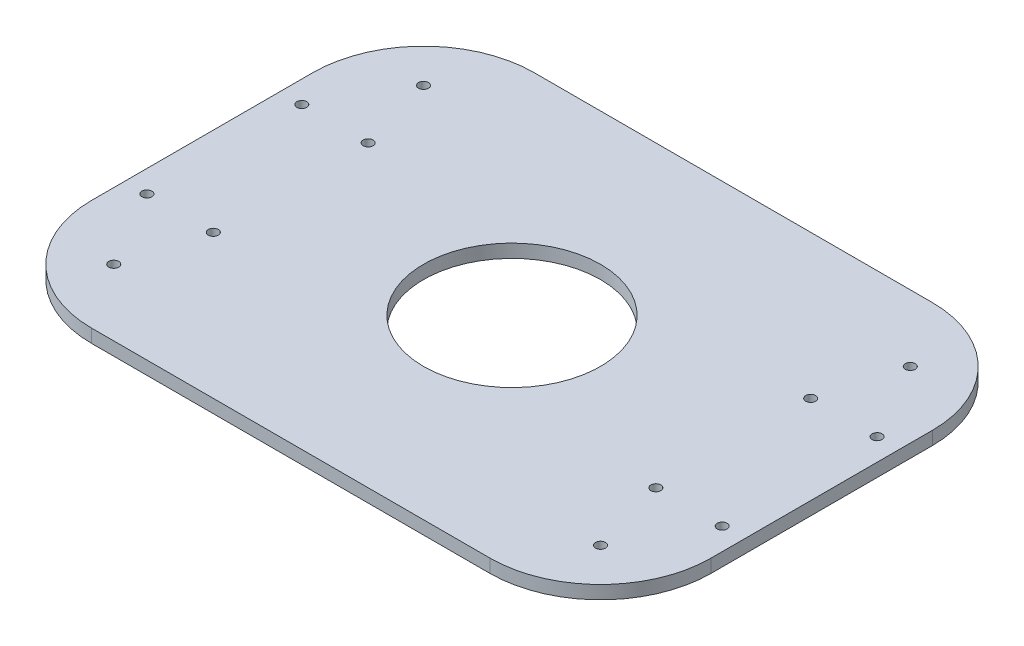
ISO-10303-21;
HEADER;
FILE_DESCRIPTION(('STEP AP214'),'2;1');
FILE_NAME('part.step','',(''),(''),'','','');
FILE_SCHEMA(('AUTOMOTIVE_DESIGN { 1 0 10303 214 1 1 1 1 }'));
ENDSEC;
DATA;
#1=APPLICATION_CONTEXT('core data for automotive mechanical design processes');
#2=APPLICATION_PROTOCOL_DEFINITION('international standard','automotive_design',2000,#1);
#3=PRODUCT_CONTEXT('',#1,'mechanical');
#4=PRODUCT('Part','Part','',(#3));
#5=PRODUCT_RELATED_PRODUCT_CATEGORY('part','',(#4));
#6=PRODUCT_DEFINITION_FORMATION('','',#4);
#7=PRODUCT_DEFINITION_CONTEXT('part definition',#1,'design');
#8=PRODUCT_DEFINITION('design','',#6,#7);
#9=PRODUCT_DEFINITION_SHAPE('','',#8);
#10=(LENGTH_UNIT() NAMED_UNIT(*) SI_UNIT(.MILLI.,.METRE.));
#11=(NAMED_UNIT(*) PLANE_ANGLE_UNIT() SI_UNIT($,.RADIAN.));
#12=(NAMED_UNIT(*) SI_UNIT($,.STERADIAN.) SOLID_ANGLE_UNIT());
#13=UNCERTAINTY_MEASURE_WITH_UNIT(LENGTH_MEASURE(1.E-05),#10,'distance_accuracy_value','');
#14=(GEOMETRIC_REPRESENTATION_CONTEXT(3) GLOBAL_UNCERTAINTY_ASSIGNED_CONTEXT((#13)) GLOBAL_UNIT_ASSIGNED_CONTEXT((#10,
#11,#12)) REPRESENTATION_CONTEXT('',''));
#15=CARTESIAN_POINT('',(0.,0.,0.));
#16=DIRECTION('',(0.,0.,1.));
#17=DIRECTION('',(1.,0.,0.));
#18=AXIS2_PLACEMENT_3D('',#15,#16,#17);
#19=CARTESIAN_POINT('',(0.,6.,0.));
#20=DIRECTION('',(0.,1.,0.));
#21=DIRECTION('',(0.,0.,1.));
#22=AXIS2_PLACEMENT_3D('',#19,#20,#21);
#23=PLANE('',#22);
#24=DIRECTION('',(0.,0.,1.));
#25=VECTOR('',#24,1.);
#26=CARTESIAN_POINT('',(140.,6.,0.));
#27=LINE('',#26,#25);
#28=CARTESIAN_POINT('',(140.,6.,-49.9999999999997));
#29=VERTEX_POINT('',#28);
#30=CARTESIAN_POINT('',(140.,6.,49.9999999999997));
#31=VERTEX_POINT('',#30);
#32=EDGE_CURVE('E371',#29,#31,#27,.T.);
#33=ORIENTED_EDGE('',*,*,#32,.F.);
#34=CARTESIAN_POINT('',(90.,6.,-50.));
#35=DIRECTION('',(0.,1.,0.));
#36=DIRECTION('',(0.,0.,1.));
#37=AXIS2_PLACEMENT_3D('',#34,#35,#36);
#38=CIRCLE('',#37,50.);
#39=CARTESIAN_POINT('',(90.,6.,-100.));
#40=VERTEX_POINT('',#39);
#41=EDGE_CURVE('E356',#29,#40,#38,.T.);
#42=ORIENTED_EDGE('',*,*,#41,.T.);
#43=DIRECTION('',(-1.,0.,0.));
#44=VECTOR('',#43,1.);
#45=CARTESIAN_POINT('',(-220.,6.,-100.));
#46=LINE('',#45,#44);
#47=CARTESIAN_POINT('',(-90.,6.,-100.));
#48=VERTEX_POINT('',#47);
#49=EDGE_CURVE('E368',#40,#48,#46,.T.);
#50=ORIENTED_EDGE('',*,*,#49,.T.);
#51=CARTESIAN_POINT('',(-90.,6.,-50.));
#52=DIRECTION('',(0.,1.,0.));
#53=DIRECTION('',(0.,0.,1.));
#54=AXIS2_PLACEMENT_3D('',#51,#52,#53);
#55=CIRCLE('',#54,50.);
#56=CARTESIAN_POINT('',(-140.,6.,-49.9999999999997));
#57=VERTEX_POINT('',#56);
#58=EDGE_CURVE('E304',#48,#57,#55,.T.);
#59=ORIENTED_EDGE('',*,*,#58,.T.);
#60=DIRECTION('',(0.,0.,1.));
#61=VECTOR('',#60,1.);
#62=CARTESIAN_POINT('',(-140.,6.,0.));
#63=LINE('',#62,#61);
#64=CARTESIAN_POINT('',(-140.,6.,49.9999999999996));
#65=VERTEX_POINT('',#64);
#66=EDGE_CURVE('E444',#57,#65,#63,.T.);
#67=ORIENTED_EDGE('',*,*,#66,.T.);
#68=CARTESIAN_POINT('',(-90.,6.,50.));
#69=DIRECTION('',(0.,1.,0.));
#70=DIRECTION('',(0.,0.,1.));
#71=AXIS2_PLACEMENT_3D('',#68,#69,#70);
#72=CIRCLE('',#71,50.);
#73=CARTESIAN_POINT('',(-90.,6.,100.));
#74=VERTEX_POINT('',#73);
#75=EDGE_CURVE('E448',#74,#65,#72,.F.);
#76=ORIENTED_EDGE('',*,*,#75,.F.);
#77=DIRECTION('',(1.,0.,0.));
#78=VECTOR('',#77,1.);
#79=CARTESIAN_POINT('',(-220.,6.,100.));
#80=LINE('',#79,#78);
#81=CARTESIAN_POINT('',(90.,6.,100.));
#82=VERTEX_POINT('',#81);
#83=EDGE_CURVE('E374',#74,#82,#80,.T.);
#84=ORIENTED_EDGE('',*,*,#83,.T.);
#85=CARTESIAN_POINT('',(90.,6.,50.));
#86=DIRECTION('',(0.,1.,0.));
#87=DIRECTION('',(0.,0.,1.));
#88=AXIS2_PLACEMENT_3D('',#85,#86,#87);
#89=CIRCLE('',#88,50.);
#90=EDGE_CURVE('E458',#82,#31,#89,.T.);
#91=ORIENTED_EDGE('',*,*,#90,.T.);
#92=EDGE_LOOP('',(#33,#42,#50,#59,#67,#76,#84,#91));
#93=FACE_BOUND('',#92,.T.);
#94=CARTESIAN_POINT('',(-130.,6.,-35.));
#95=DIRECTION('',(0.,1.,0.));
#96=DIRECTION('',(0.,0.,1.));
#97=AXIS2_PLACEMENT_3D('',#94,#95,#96);
#98=CIRCLE('',#97,2.25000000000001);
#99=CARTESIAN_POINT('',(-130.,6.,-32.75));
#100=VERTEX_POINT('',#99);
#101=EDGE_CURVE('E452',#100,#100,#98,.F.);
#102=ORIENTED_EDGE('',*,*,#101,.T.);
#103=EDGE_LOOP('',(#102));
#104=FACE_BOUND('',#103,.T.);
#105=CARTESIAN_POINT('',(-110.,6.,-70.));
#106=DIRECTION('',(0.,1.,0.));
#107=DIRECTION('',(0.,0.,1.));
#108=AXIS2_PLACEMENT_3D('',#105,#106,#107);
#109=CIRCLE('',#108,2.25);
#110=CARTESIAN_POINT('',(-110.,6.,-67.75));
#111=VERTEX_POINT('',#110);
#112=EDGE_CURVE('E466',#111,#111,#109,.F.);
#113=ORIENTED_EDGE('',*,*,#112,.T.);
#114=EDGE_LOOP('',(#113));
#115=FACE_BOUND('',#114,.T.);
#116=CARTESIAN_POINT('',(110.,6.,70.));
#117=DIRECTION('',(0.,-1.,0.));
#118=DIRECTION('',(0.,0.,-1.));
#119=AXIS2_PLACEMENT_3D('',#116,#117,#118);
#120=CIRCLE('',#119,2.25);
#121=CARTESIAN_POINT('',(110.,6.,67.75));
#122=VERTEX_POINT('',#121);
#123=EDGE_CURVE('E493',#122,#122,#120,.T.);
#124=ORIENTED_EDGE('',*,*,#123,.T.);
#125=EDGE_LOOP('',(#124));
#126=FACE_BOUND('',#125,.T.);
#127=CARTESIAN_POINT('',(-110.,6.,70.));
#128=DIRECTION('',(0.,1.,0.));
#129=DIRECTION('',(0.,0.,1.));
#130=AXIS2_PLACEMENT_3D('',#127,#128,#129);
#131=CIRCLE('',#130,2.25);
#132=CARTESIAN_POINT('',(-110.,6.,72.25));
#133=VERTEX_POINT('',#132);
#134=EDGE_CURVE('E490',#133,#133,#131,.T.);
#135=ORIENTED_EDGE('',*,*,#134,.F.);
#136=EDGE_LOOP('',(#135));
#137=FACE_BOUND('',#136,.T.);
#138=CARTESIAN_POINT('',(-100.,6.,35.));
#139=DIRECTION('',(0.,1.,0.));
#140=DIRECTION('',(0.,0.,1.));
#141=AXIS2_PLACEMENT_3D('',#138,#139,#140);
#142=CIRCLE('',#141,2.25);
#143=CARTESIAN_POINT('',(-100.,6.,37.25));
#144=VERTEX_POINT('',#143);
#145=EDGE_CURVE('E487',#144,#144,#142,.T.);
#146=ORIENTED_EDGE('',*,*,#145,.F.);
#147=EDGE_LOOP('',(#146));
#148=FACE_BOUND('',#147,.T.);
#149=CARTESIAN_POINT('',(-130.,6.,35.));
#150=DIRECTION('',(0.,1.,0.));
#151=DIRECTION('',(0.,0.,1.));
#152=AXIS2_PLACEMENT_3D('',#149,#150,#151);
#153=CIRCLE('',#152,2.25000000000001);
#154=CARTESIAN_POINT('',(-130.,6.,37.25));
#155=VERTEX_POINT('',#154);
#156=EDGE_CURVE('E484',#155,#155,#153,.T.);
#157=ORIENTED_EDGE('',*,*,#156,.F.);
#158=EDGE_LOOP('',(#157));
#159=FACE_BOUND('',#158,.T.);
#160=CARTESIAN_POINT('',(0.,6.,0.));
#161=DIRECTION('',(0.,1.,0.));
#162=DIRECTION('',(0.,0.,1.));
#163=AXIS2_PLACEMENT_3D('',#160,#161,#162);
#164=CIRCLE('',#163,40.);
#165=CARTESIAN_POINT('',(0.,6.,40.));
#166=VERTEX_POINT('',#165);
#167=EDGE_CURVE('E385',#166,#166,#164,.T.);
#168=ORIENTED_EDGE('',*,*,#167,.F.);
#169=EDGE_LOOP('',(#168));
#170=FACE_BOUND('',#169,.T.);
#171=CARTESIAN_POINT('',(100.,6.,35.));
#172=DIRECTION('',(0.,-1.,0.));
#173=DIRECTION('',(0.,0.,-1.));
#174=AXIS2_PLACEMENT_3D('',#171,#172,#173);
#175=CIRCLE('',#174,2.25);
#176=CARTESIAN_POINT('',(100.,6.,32.75));
#177=VERTEX_POINT('',#176);
#178=EDGE_CURVE('E476',#177,#177,#175,.T.);
#179=ORIENTED_EDGE('',*,*,#178,.T.);
#180=EDGE_LOOP('',(#179));
#181=FACE_BOUND('',#180,.T.);
#182=CARTESIAN_POINT('',(-100.,6.,-35.));
#183=DIRECTION('',(0.,1.,0.));
#184=DIRECTION('',(0.,0.,1.));
#185=AXIS2_PLACEMENT_3D('',#182,#183,#184);
#186=CIRCLE('',#185,2.25);
#187=CARTESIAN_POINT('',(-100.,6.,-32.75));
#188=VERTEX_POINT('',#187);
#189=EDGE_CURVE('E455',#188,#188,#186,.F.);
#190=ORIENTED_EDGE('',*,*,#189,.T.);
#191=EDGE_LOOP('',(#190));
#192=FACE_BOUND('',#191,.T.);
#193=CARTESIAN_POINT('',(110.,6.,-70.));
#194=DIRECTION('',(0.,1.,0.));
#195=DIRECTION('',(0.,0.,1.));
#196=AXIS2_PLACEMENT_3D('',#193,#194,#195);
#197=CIRCLE('',#196,2.25);
#198=CARTESIAN_POINT('',(110.,6.,-67.75));
#199=VERTEX_POINT('',#198);
#200=EDGE_CURVE('E469',#199,#199,#197,.T.);
#201=ORIENTED_EDGE('',*,*,#200,.F.);
#202=EDGE_LOOP('',(#201));
#203=FACE_BOUND('',#202,.T.);
#204=CARTESIAN_POINT('',(100.,6.,-35.));
#205=DIRECTION('',(0.,1.,0.));
#206=DIRECTION('',(0.,0.,1.));
#207=AXIS2_PLACEMENT_3D('',#204,#205,#206);
#208=CIRCLE('',#207,2.25);
#209=CARTESIAN_POINT('',(100.,6.,-32.75));
#210=VERTEX_POINT('',#209);
#211=EDGE_CURVE('E479',#210,#210,#208,.T.);
#212=ORIENTED_EDGE('',*,*,#211,.F.);
#213=EDGE_LOOP('',(#212));
#214=FACE_BOUND('',#213,.T.);
#215=CARTESIAN_POINT('',(130.,6.,-35.));
#216=DIRECTION('',(0.,1.,0.));
#217=DIRECTION('',(0.,0.,1.));
#218=AXIS2_PLACEMENT_3D('',#215,#216,#217);
#219=CIRCLE('',#218,2.25000000000001);
#220=CARTESIAN_POINT('',(130.,6.,-32.75));
#221=VERTEX_POINT('',#220);
#222=EDGE_CURVE('E475',#221,#221,#219,.T.);
#223=ORIENTED_EDGE('',*,*,#222,.F.);
#224=EDGE_LOOP('',(#223));
#225=FACE_BOUND('',#224,.T.);
#226=CARTESIAN_POINT('',(130.,6.,35.));
#227=DIRECTION('',(0.,-1.,0.));
#228=DIRECTION('',(0.,0.,-1.));
#229=AXIS2_PLACEMENT_3D('',#226,#227,#228);
#230=CIRCLE('',#229,2.25000000000001);
#231=CARTESIAN_POINT('',(130.,6.,32.75));
#232=VERTEX_POINT('',#231);
#233=EDGE_CURVE('E472',#232,#232,#230,.T.);
#234=ORIENTED_EDGE('',*,*,#233,.T.);
#235=EDGE_LOOP('',(#234));
#236=FACE_BOUND('',#235,.T.);
#237=ADVANCED_FACE('F287',(#93,#104,#115,#126,#137,#148,#159,#170,#181,#192,#203,#214,#225,
#236),#23,.T.);
#238=CARTESIAN_POINT('',(0.,0.,0.));
#239=DIRECTION('',(0.,1.,0.));
#240=DIRECTION('',(0.,0.,1.));
#241=AXIS2_PLACEMENT_3D('',#238,#239,#240);
#242=PLANE('',#241);
#243=CARTESIAN_POINT('',(130.,0.,-35.));
#244=DIRECTION('',(0.,1.,0.));
#245=DIRECTION('',(0.,0.,1.));
#246=AXIS2_PLACEMENT_3D('',#243,#244,#245);
#247=CIRCLE('',#246,2.25000000000001);
#248=CARTESIAN_POINT('',(130.,0.,-32.75));
#249=VERTEX_POINT('',#248);
#250=EDGE_CURVE('E420',#249,#249,#247,.T.);
#251=ORIENTED_EDGE('',*,*,#250,.T.);
#252=EDGE_LOOP('',(#251));
#253=FACE_BOUND('',#252,.T.);
#254=CARTESIAN_POINT('',(100.,0.,-35.));
#255=DIRECTION('',(0.,1.,0.));
#256=DIRECTION('',(0.,0.,1.));
#257=AXIS2_PLACEMENT_3D('',#254,#255,#256);
#258=CIRCLE('',#257,2.25);
#259=CARTESIAN_POINT('',(100.,0.,-32.75));
#260=VERTEX_POINT('',#259);
#261=EDGE_CURVE('E418',#260,#260,#258,.T.);
#262=ORIENTED_EDGE('',*,*,#261,.T.);
#263=EDGE_LOOP('',(#262));
#264=FACE_BOUND('',#263,.T.);
#265=CARTESIAN_POINT('',(110.,0.,-70.));
#266=DIRECTION('',(0.,1.,0.));
#267=DIRECTION('',(0.,0.,1.));
#268=AXIS2_PLACEMENT_3D('',#265,#266,#267);
#269=CIRCLE('',#268,2.25);
#270=CARTESIAN_POINT('',(110.,0.,-67.75));
#271=VERTEX_POINT('',#270);
#272=EDGE_CURVE('E414',#271,#271,#269,.T.);
#273=ORIENTED_EDGE('',*,*,#272,.T.);
#274=EDGE_LOOP('',(#273));
#275=FACE_BOUND('',#274,.T.);
#276=CARTESIAN_POINT('',(-130.,0.,-35.));
#277=DIRECTION('',(0.,1.,0.));
#278=DIRECTION('',(0.,0.,1.));
#279=AXIS2_PLACEMENT_3D('',#276,#277,#278);
#280=CIRCLE('',#279,2.25000000000001);
#281=CARTESIAN_POINT('',(-130.,0.,-32.75));
#282=VERTEX_POINT('',#281);
#283=EDGE_CURVE('E412',#282,#282,#280,.F.);
#284=ORIENTED_EDGE('',*,*,#283,.F.);
#285=EDGE_LOOP('',(#284));
#286=FACE_BOUND('',#285,.T.);
#287=CARTESIAN_POINT('',(-100.,0.,-35.));
#288=DIRECTION('',(0.,1.,0.));
#289=DIRECTION('',(0.,0.,1.));
#290=AXIS2_PLACEMENT_3D('',#287,#288,#289);
#291=CIRCLE('',#290,2.25);
#292=CARTESIAN_POINT('',(-100.,0.,-32.75));
#293=VERTEX_POINT('',#292);
#294=EDGE_CURVE('E409',#293,#293,#291,.F.);
#295=ORIENTED_EDGE('',*,*,#294,.F.);
#296=EDGE_LOOP('',(#295));
#297=FACE_BOUND('',#296,.T.);
#298=CARTESIAN_POINT('',(-110.,0.,-70.));
#299=DIRECTION('',(0.,1.,0.));
#300=DIRECTION('',(0.,0.,1.));
#301=AXIS2_PLACEMENT_3D('',#298,#299,#300);
#302=CIRCLE('',#301,2.25);
#303=CARTESIAN_POINT('',(-110.,0.,-67.75));
#304=VERTEX_POINT('',#303);
#305=EDGE_CURVE('E406',#304,#304,#302,.F.);
#306=ORIENTED_EDGE('',*,*,#305,.F.);
#307=EDGE_LOOP('',(#306));
#308=FACE_BOUND('',#307,.T.);
#309=CARTESIAN_POINT('',(100.,0.,35.));
#310=DIRECTION('',(0.,1.,0.));
#311=DIRECTION('',(0.,0.,1.));
#312=AXIS2_PLACEMENT_3D('',#309,#310,#311);
#313=CIRCLE('',#312,2.25);
#314=CARTESIAN_POINT('',(100.,0.,37.25));
#315=VERTEX_POINT('',#314);
#316=EDGE_CURVE('E403',#315,#315,#313,.F.);
#317=ORIENTED_EDGE('',*,*,#316,.F.);
#318=EDGE_LOOP('',(#317));
#319=FACE_BOUND('',#318,.T.);
#320=CARTESIAN_POINT('',(110.,0.,70.));
#321=DIRECTION('',(0.,1.,0.));
#322=DIRECTION('',(0.,0.,1.));
#323=AXIS2_PLACEMENT_3D('',#320,#321,#322);
#324=CIRCLE('',#323,2.25);
#325=CARTESIAN_POINT('',(110.,0.,72.25));
#326=VERTEX_POINT('',#325);
#327=EDGE_CURVE('E400',#326,#326,#324,.F.);
#328=ORIENTED_EDGE('',*,*,#327,.F.);
#329=EDGE_LOOP('',(#328));
#330=FACE_BOUND('',#329,.T.);
#331=CARTESIAN_POINT('',(0.,0.,0.));
#332=DIRECTION('',(0.,1.,0.));
#333=DIRECTION('',(0.,0.,1.));
#334=AXIS2_PLACEMENT_3D('',#331,#332,#333);
#335=CIRCLE('',#334,40.);
#336=CARTESIAN_POINT('',(0.,0.,40.));
#337=VERTEX_POINT('',#336);
#338=EDGE_CURVE('E425',#337,#337,#335,.T.);
#339=ORIENTED_EDGE('',*,*,#338,.T.);
#340=EDGE_LOOP('',(#339));
#341=FACE_BOUND('',#340,.T.);
#342=CARTESIAN_POINT('',(-130.,0.,35.));
#343=DIRECTION('',(0.,1.,0.));
#344=DIRECTION('',(0.,0.,1.));
#345=AXIS2_PLACEMENT_3D('',#342,#343,#344);
#346=CIRCLE('',#345,2.25000000000001);
#347=CARTESIAN_POINT('',(-130.,0.,37.25));
#348=VERTEX_POINT('',#347);
#349=EDGE_CURVE('E390',#348,#348,#346,.T.);
#350=ORIENTED_EDGE('',*,*,#349,.T.);
#351=EDGE_LOOP('',(#350));
#352=FACE_BOUND('',#351,.T.);
#353=CARTESIAN_POINT('',(-100.,0.,35.));
#354=DIRECTION('',(0.,1.,0.));
#355=DIRECTION('',(0.,0.,1.));
#356=AXIS2_PLACEMENT_3D('',#353,#354,#355);
#357=CIRCLE('',#356,2.25);
#358=CARTESIAN_POINT('',(-100.,0.,37.25));
#359=VERTEX_POINT('',#358);
#360=EDGE_CURVE('E393',#359,#359,#357,.T.);
#361=ORIENTED_EDGE('',*,*,#360,.T.);
#362=EDGE_LOOP('',(#361));
#363=FACE_BOUND('',#362,.T.);
#364=CARTESIAN_POINT('',(-110.,0.,70.));
#365=DIRECTION('',(0.,1.,0.));
#366=DIRECTION('',(0.,0.,1.));
#367=AXIS2_PLACEMENT_3D('',#364,#365,#366);
#368=CIRCLE('',#367,2.25);
#369=CARTESIAN_POINT('',(-110.,0.,72.25));
#370=VERTEX_POINT('',#369);
#371=EDGE_CURVE('E397',#370,#370,#368,.T.);
#372=ORIENTED_EDGE('',*,*,#371,.T.);
#373=EDGE_LOOP('',(#372));
#374=FACE_BOUND('',#373,.T.);
#375=CARTESIAN_POINT('',(90.,0.,-50.));
#376=DIRECTION('',(0.,1.,0.));
#377=DIRECTION('',(0.,0.,1.));
#378=AXIS2_PLACEMENT_3D('',#375,#376,#377);
#379=CIRCLE('',#378,50.);
#380=CARTESIAN_POINT('',(140.,0.,-49.9999999999997));
#381=VERTEX_POINT('',#380);
#382=CARTESIAN_POINT('',(90.0000000000001,0.,-100.));
#383=VERTEX_POINT('',#382);
#384=EDGE_CURVE('E312',#381,#383,#379,.T.);
#385=ORIENTED_EDGE('',*,*,#384,.F.);
#386=DIRECTION('',(0.,0.,1.));
#387=VECTOR('',#386,1.);
#388=CARTESIAN_POINT('',(140.,0.,0.));
#389=LINE('',#388,#387);
#390=CARTESIAN_POINT('',(140.,0.,49.9999999999997));
#391=VERTEX_POINT('',#390);
#392=EDGE_CURVE('E12',#381,#391,#389,.T.);
#393=ORIENTED_EDGE('',*,*,#392,.T.);
#394=CARTESIAN_POINT('',(90.,0.,50.));
#395=DIRECTION('',(0.,1.,0.));
#396=DIRECTION('',(0.,0.,1.));
#397=AXIS2_PLACEMENT_3D('',#394,#395,#396);
#398=CIRCLE('',#397,50.);
#399=CARTESIAN_POINT('',(90.,0.,100.));
#400=VERTEX_POINT('',#399);
#401=EDGE_CURVE('E394',#400,#391,#398,.T.);
#402=ORIENTED_EDGE('',*,*,#401,.F.);
#403=DIRECTION('',(1.,0.,0.));
#404=VECTOR('',#403,1.);
#405=CARTESIAN_POINT('',(-220.,0.,100.));
#406=LINE('',#405,#404);
#407=CARTESIAN_POINT('',(-90.,0.,100.));
#408=VERTEX_POINT('',#407);
#409=EDGE_CURVE('E382',#408,#400,#406,.T.);
#410=ORIENTED_EDGE('',*,*,#409,.F.);
#411=CARTESIAN_POINT('',(-90.,0.,50.));
#412=DIRECTION('',(0.,1.,0.));
#413=DIRECTION('',(0.,0.,1.));
#414=AXIS2_PLACEMENT_3D('',#411,#412,#413);
#415=CIRCLE('',#414,50.);
#416=CARTESIAN_POINT('',(-140.,0.,49.9999999999996));
#417=VERTEX_POINT('',#416);
#418=EDGE_CURVE('E435',#408,#417,#415,.F.);
#419=ORIENTED_EDGE('',*,*,#418,.T.);
#420=DIRECTION('',(0.,0.,1.));
#421=VECTOR('',#420,1.);
#422=CARTESIAN_POINT('',(-140.,0.,0.));
#423=LINE('',#422,#421);
#424=CARTESIAN_POINT('',(-140.,0.,-49.9999999999997));
#425=VERTEX_POINT('',#424);
#426=EDGE_CURVE('E296',#425,#417,#423,.T.);
#427=ORIENTED_EDGE('',*,*,#426,.F.);
#428=CARTESIAN_POINT('',(-90.,0.,-50.));
#429=DIRECTION('',(0.,1.,0.));
#430=DIRECTION('',(0.,0.,1.));
#431=AXIS2_PLACEMENT_3D('',#428,#429,#430);
#432=CIRCLE('',#431,50.);
#433=CARTESIAN_POINT('',(-90.,0.,-100.));
#434=VERTEX_POINT('',#433);
#435=EDGE_CURVE('E439',#434,#425,#432,.T.);
#436=ORIENTED_EDGE('',*,*,#435,.F.);
#437=DIRECTION('',(-1.,0.,0.));
#438=VECTOR('',#437,1.);
#439=CARTESIAN_POINT('',(-220.,0.,-100.));
#440=LINE('',#439,#438);
#441=EDGE_CURVE('E378',#383,#434,#440,.T.);
#442=ORIENTED_EDGE('',*,*,#441,.F.);
#443=EDGE_LOOP('',(#385,#393,#402,#410,#419,#427,#436,#442));
#444=FACE_BOUND('',#443,.T.);
#445=CARTESIAN_POINT('',(130.,0.,35.));
#446=DIRECTION('',(0.,1.,0.));
#447=DIRECTION('',(0.,0.,1.));
#448=AXIS2_PLACEMENT_3D('',#445,#446,#447);
#449=CIRCLE('',#448,2.25000000000001);
#450=CARTESIAN_POINT('',(130.,0.,37.25));
#451=VERTEX_POINT('',#450);
#452=EDGE_CURVE('E291',#451,#451,#449,.F.);
#453=ORIENTED_EDGE('',*,*,#452,.F.);
#454=EDGE_LOOP('',(#453));
#455=FACE_BOUND('',#454,.T.);
#456=ADVANCED_FACE('F509',(#253,#264,#275,#286,#297,#308,#319,#330,#341,#352,#363,#374,#444,
#455),#242,.F.);
#457=CARTESIAN_POINT('',(-220.,6.,-100.));
#458=DIRECTION('',(0.,0.,1.));
#459=DIRECTION('',(1.,0.,0.));
#460=AXIS2_PLACEMENT_3D('',#457,#458,#459);
#461=PLANE('',#460);
#462=DIRECTION('',(0.,1.,0.));
#463=VECTOR('',#462,1.);
#464=CARTESIAN_POINT('',(90.,-4.,-100.));
#465=LINE('',#464,#463);
#466=EDGE_CURVE('E353',#383,#40,#465,.T.);
#467=ORIENTED_EDGE('',*,*,#466,.F.);
#468=ORIENTED_EDGE('',*,*,#441,.T.);
#469=DIRECTION('',(0.,1.,0.));
#470=VECTOR('',#469,1.);
#471=CARTESIAN_POINT('',(-90.,-4.,-100.));
#472=LINE('',#471,#470);
#473=EDGE_CURVE('E363',#434,#48,#472,.T.);
#474=ORIENTED_EDGE('',*,*,#473,.T.);
#475=ORIENTED_EDGE('',*,*,#49,.F.);
#476=EDGE_LOOP('',(#467,#468,#474,#475));
#477=FACE_BOUND('',#476,.T.);
#478=ADVANCED_FACE('F373',(#477),#461,.F.);
#479=CARTESIAN_POINT('',(-220.,6.,100.));
#480=DIRECTION('',(0.,0.,-1.));
#481=DIRECTION('',(-1.,0.,0.));
#482=AXIS2_PLACEMENT_3D('',#479,#480,#481);
#483=PLANE('',#482);
#484=ORIENTED_EDGE('',*,*,#409,.T.);
#485=DIRECTION('',(0.,1.,0.));
#486=VECTOR('',#485,1.);
#487=CARTESIAN_POINT('',(90.,-4.,100.));
#488=LINE('',#487,#486);
#489=EDGE_CURVE('E454',#400,#82,#488,.T.);
#490=ORIENTED_EDGE('',*,*,#489,.T.);
#491=ORIENTED_EDGE('',*,*,#83,.F.);
#492=DIRECTION('',(0.,1.,0.));
#493=VECTOR('',#492,1.);
#494=CARTESIAN_POINT('',(-90.,-4.,100.));
#495=LINE('',#494,#493);
#496=EDGE_CURVE('E362',#74,#408,#495,.F.);
#497=ORIENTED_EDGE('',*,*,#496,.T.);
#498=EDGE_LOOP('',(#484,#490,#491,#497));
#499=FACE_BOUND('',#498,.T.);
#500=ADVANCED_FACE('F289',(#499),#483,.F.);
#501=CARTESIAN_POINT('',(0.,6.,0.));
#502=DIRECTION('',(0.,-1.,0.));
#503=DIRECTION('',(0.,0.,-1.));
#504=AXIS2_PLACEMENT_3D('',#501,#502,#503);
#505=CYLINDRICAL_SURFACE('',#504,40.);
#506=ORIENTED_EDGE('',*,*,#167,.T.);
#507=EDGE_LOOP('',(#506));
#508=FACE_BOUND('',#507,.T.);
#509=ORIENTED_EDGE('',*,*,#338,.F.);
#510=EDGE_LOOP('',(#509));
#511=FACE_BOUND('',#510,.T.);
#512=ADVANCED_FACE('F548',(#508,#511),#505,.F.);
#513=CARTESIAN_POINT('',(-140.,-4.,0.));
#514=DIRECTION('',(-1.,0.,0.));
#515=DIRECTION('',(0.,0.,1.));
#516=AXIS2_PLACEMENT_3D('',#513,#514,#515);
#517=PLANE('',#516);
#518=ORIENTED_EDGE('',*,*,#426,.T.);
#519=DIRECTION('',(0.,1.,0.));
#520=VECTOR('',#519,1.);
#521=CARTESIAN_POINT('',(-140.,-4.,49.9999999999996));
#522=LINE('',#521,#520);
#523=EDGE_CURVE('E442',#417,#65,#522,.T.);
#524=ORIENTED_EDGE('',*,*,#523,.T.);
#525=ORIENTED_EDGE('',*,*,#66,.F.);
#526=DIRECTION('',(0.,1.,0.));
#527=VECTOR('',#526,1.);
#528=CARTESIAN_POINT('',(-140.,-4.,-49.9999999999997));
#529=LINE('',#528,#527);
#530=EDGE_CURVE('E441',#425,#57,#529,.T.);
#531=ORIENTED_EDGE('',*,*,#530,.F.);
#532=EDGE_LOOP('',(#518,#524,#525,#531));
#533=FACE_BOUND('',#532,.T.);
#534=ADVANCED_FACE('F529',(#533),#517,.T.);
#535=CARTESIAN_POINT('',(-90.,-4.,50.));
#536=DIRECTION('',(0.,1.,0.));
#537=DIRECTION('',(0.,0.,1.));
#538=AXIS2_PLACEMENT_3D('',#535,#536,#537);
#539=CYLINDRICAL_SURFACE('',#538,50.);
#540=ORIENTED_EDGE('',*,*,#496,.F.);
#541=ORIENTED_EDGE('',*,*,#75,.T.);
#542=ORIENTED_EDGE('',*,*,#523,.F.);
#543=ORIENTED_EDGE('',*,*,#418,.F.);
#544=EDGE_LOOP('',(#540,#541,#542,#543));
#545=FACE_BOUND('',#544,.T.);
#546=ADVANCED_FACE('F539',(#545),#539,.T.);
#547=CARTESIAN_POINT('',(-90.,-4.,-50.));
#548=DIRECTION('',(0.,1.,0.));
#549=DIRECTION('',(0.,0.,1.));
#550=AXIS2_PLACEMENT_3D('',#547,#548,#549);
#551=CYLINDRICAL_SURFACE('',#550,50.);
#552=ORIENTED_EDGE('',*,*,#435,.T.);
#553=ORIENTED_EDGE('',*,*,#530,.T.);
#554=ORIENTED_EDGE('',*,*,#58,.F.);
#555=ORIENTED_EDGE('',*,*,#473,.F.);
#556=EDGE_LOOP('',(#552,#553,#554,#555));
#557=FACE_BOUND('',#556,.T.);
#558=ADVANCED_FACE('F526',(#557),#551,.T.);
#559=CARTESIAN_POINT('',(140.,-4.,0.));
#560=DIRECTION('',(-1.,0.,0.));
#561=DIRECTION('',(0.,0.,1.));
#562=AXIS2_PLACEMENT_3D('',#559,#560,#561);
#563=PLANE('',#562);
#564=DIRECTION('',(0.,1.,0.));
#565=VECTOR('',#564,1.);
#566=CARTESIAN_POINT('',(140.,-4.,-49.9999999999997));
#567=LINE('',#566,#565);
#568=EDGE_CURVE('E460',#381,#29,#567,.T.);
#569=ORIENTED_EDGE('',*,*,#568,.T.);
#570=ORIENTED_EDGE('',*,*,#32,.T.);
#571=DIRECTION('',(0.,1.,0.));
#572=VECTOR('',#571,1.);
#573=CARTESIAN_POINT('',(140.,-4.,49.9999999999997));
#574=LINE('',#573,#572);
#575=EDGE_CURVE('E463',#391,#31,#574,.T.);
#576=ORIENTED_EDGE('',*,*,#575,.F.);
#577=ORIENTED_EDGE('',*,*,#392,.F.);
#578=EDGE_LOOP('',(#569,#570,#576,#577));
#579=FACE_BOUND('',#578,.T.);
#580=ADVANCED_FACE('F546',(#579),#563,.F.);
#581=CARTESIAN_POINT('',(90.,-4.,50.));
#582=DIRECTION('',(0.,1.,0.));
#583=DIRECTION('',(0.,0.,1.));
#584=AXIS2_PLACEMENT_3D('',#581,#582,#583);
#585=CYLINDRICAL_SURFACE('',#584,50.);
#586=ORIENTED_EDGE('',*,*,#401,.T.);
#587=ORIENTED_EDGE('',*,*,#575,.T.);
#588=ORIENTED_EDGE('',*,*,#90,.F.);
#589=ORIENTED_EDGE('',*,*,#489,.F.);
#590=EDGE_LOOP('',(#586,#587,#588,#589));
#591=FACE_BOUND('',#590,.T.);
#592=ADVANCED_FACE('F537',(#591),#585,.T.);
#593=CARTESIAN_POINT('',(90.,-4.,-50.));
#594=DIRECTION('',(0.,1.,0.));
#595=DIRECTION('',(0.,0.,1.));
#596=AXIS2_PLACEMENT_3D('',#593,#594,#595);
#597=CYLINDRICAL_SURFACE('',#596,50.);
#598=ORIENTED_EDGE('',*,*,#384,.T.);
#599=ORIENTED_EDGE('',*,*,#466,.T.);
#600=ORIENTED_EDGE('',*,*,#41,.F.);
#601=ORIENTED_EDGE('',*,*,#568,.F.);
#602=EDGE_LOOP('',(#598,#599,#600,#601));
#603=FACE_BOUND('',#602,.T.);
#604=ADVANCED_FACE('F355',(#603),#597,.T.);
#605=CARTESIAN_POINT('',(-130.,-4.,35.));
#606=DIRECTION('',(0.,1.,0.));
#607=DIRECTION('',(0.,0.,1.));
#608=AXIS2_PLACEMENT_3D('',#605,#606,#607);
#609=CYLINDRICAL_SURFACE('',#608,2.25000000000001);
#610=ORIENTED_EDGE('',*,*,#156,.T.);
#611=EDGE_LOOP('',(#610));
#612=FACE_BOUND('',#611,.T.);
#613=ORIENTED_EDGE('',*,*,#349,.F.);
#614=EDGE_LOOP('',(#613));
#615=FACE_BOUND('',#614,.T.);
#616=ADVANCED_FACE('F624',(#612,#615),#609,.F.);
#617=CARTESIAN_POINT('',(-100.,-4.,35.));
#618=DIRECTION('',(0.,1.,0.));
#619=DIRECTION('',(0.,0.,1.));
#620=AXIS2_PLACEMENT_3D('',#617,#618,#619);
#621=CYLINDRICAL_SURFACE('',#620,2.25);
#622=ORIENTED_EDGE('',*,*,#145,.T.);
#623=EDGE_LOOP('',(#622));
#624=FACE_BOUND('',#623,.T.);
#625=ORIENTED_EDGE('',*,*,#360,.F.);
#626=EDGE_LOOP('',(#625));
#627=FACE_BOUND('',#626,.T.);
#628=ADVANCED_FACE('F633',(#624,#627),#621,.F.);
#629=CARTESIAN_POINT('',(-110.,-4.,70.));
#630=DIRECTION('',(0.,1.,0.));
#631=DIRECTION('',(0.,0.,1.));
#632=AXIS2_PLACEMENT_3D('',#629,#630,#631);
#633=CYLINDRICAL_SURFACE('',#632,2.25);
#634=ORIENTED_EDGE('',*,*,#134,.T.);
#635=EDGE_LOOP('',(#634));
#636=FACE_BOUND('',#635,.T.);
#637=ORIENTED_EDGE('',*,*,#371,.F.);
#638=EDGE_LOOP('',(#637));
#639=FACE_BOUND('',#638,.T.);
#640=ADVANCED_FACE('F643',(#636,#639),#633,.F.);
#641=CARTESIAN_POINT('',(110.,-4.,70.));
#642=DIRECTION('',(0.,1.,0.));
#643=DIRECTION('',(0.,0.,1.));
#644=AXIS2_PLACEMENT_3D('',#641,#642,#643);
#645=CYLINDRICAL_SURFACE('',#644,2.25);
#646=ORIENTED_EDGE('',*,*,#123,.F.);
#647=EDGE_LOOP('',(#646));
#648=FACE_BOUND('',#647,.T.);
#649=ORIENTED_EDGE('',*,*,#327,.T.);
#650=EDGE_LOOP('',(#649));
#651=FACE_BOUND('',#650,.T.);
#652=ADVANCED_FACE('F505',(#648,#651),#645,.F.);
#653=CARTESIAN_POINT('',(100.,-4.,35.));
#654=DIRECTION('',(0.,1.,0.));
#655=DIRECTION('',(0.,0.,1.));
#656=AXIS2_PLACEMENT_3D('',#653,#654,#655);
#657=CYLINDRICAL_SURFACE('',#656,2.25);
#658=ORIENTED_EDGE('',*,*,#178,.F.);
#659=EDGE_LOOP('',(#658));
#660=FACE_BOUND('',#659,.T.);
#661=ORIENTED_EDGE('',*,*,#316,.T.);
#662=EDGE_LOOP('',(#661));
#663=FACE_BOUND('',#662,.T.);
#664=ADVANCED_FACE('F501',(#660,#663),#657,.F.);
#665=CARTESIAN_POINT('',(-110.,-4.,-70.));
#666=DIRECTION('',(0.,1.,0.));
#667=DIRECTION('',(0.,0.,1.));
#668=AXIS2_PLACEMENT_3D('',#665,#666,#667);
#669=CYLINDRICAL_SURFACE('',#668,2.25);
#670=ORIENTED_EDGE('',*,*,#112,.F.);
#671=EDGE_LOOP('',(#670));
#672=FACE_BOUND('',#671,.T.);
#673=ORIENTED_EDGE('',*,*,#305,.T.);
#674=EDGE_LOOP('',(#673));
#675=FACE_BOUND('',#674,.T.);
#676=ADVANCED_FACE('F504',(#672,#675),#669,.F.);
#677=CARTESIAN_POINT('',(-100.,-4.,-35.));
#678=DIRECTION('',(0.,1.,0.));
#679=DIRECTION('',(0.,0.,1.));
#680=AXIS2_PLACEMENT_3D('',#677,#678,#679);
#681=CYLINDRICAL_SURFACE('',#680,2.25);
#682=ORIENTED_EDGE('',*,*,#189,.F.);
#683=EDGE_LOOP('',(#682));
#684=FACE_BOUND('',#683,.T.);
#685=ORIENTED_EDGE('',*,*,#294,.T.);
#686=EDGE_LOOP('',(#685));
#687=FACE_BOUND('',#686,.T.);
#688=ADVANCED_FACE('F677',(#684,#687),#681,.F.);
#689=CARTESIAN_POINT('',(-130.,-4.,-35.));
#690=DIRECTION('',(0.,1.,0.));
#691=DIRECTION('',(0.,0.,1.));
#692=AXIS2_PLACEMENT_3D('',#689,#690,#691);
#693=CYLINDRICAL_SURFACE('',#692,2.25000000000001);
#694=ORIENTED_EDGE('',*,*,#101,.F.);
#695=EDGE_LOOP('',(#694));
#696=FACE_BOUND('',#695,.T.);
#697=ORIENTED_EDGE('',*,*,#283,.T.);
#698=EDGE_LOOP('',(#697));
#699=FACE_BOUND('',#698,.T.);
#700=ADVANCED_FACE('F687',(#696,#699),#693,.F.);
#701=CARTESIAN_POINT('',(110.,-4.,-70.));
#702=DIRECTION('',(0.,1.,0.));
#703=DIRECTION('',(0.,0.,1.));
#704=AXIS2_PLACEMENT_3D('',#701,#702,#703);
#705=CYLINDRICAL_SURFACE('',#704,2.25);
#706=ORIENTED_EDGE('',*,*,#200,.T.);
#707=EDGE_LOOP('',(#706));
#708=FACE_BOUND('',#707,.T.);
#709=ORIENTED_EDGE('',*,*,#272,.F.);
#710=EDGE_LOOP('',(#709));
#711=FACE_BOUND('',#710,.T.);
#712=ADVANCED_FACE('F697',(#708,#711),#705,.F.);
#713=CARTESIAN_POINT('',(100.,-4.,-35.));
#714=DIRECTION('',(0.,1.,0.));
#715=DIRECTION('',(0.,0.,1.));
#716=AXIS2_PLACEMENT_3D('',#713,#714,#715);
#717=CYLINDRICAL_SURFACE('',#716,2.25);
#718=ORIENTED_EDGE('',*,*,#211,.T.);
#719=EDGE_LOOP('',(#718));
#720=FACE_BOUND('',#719,.T.);
#721=ORIENTED_EDGE('',*,*,#261,.F.);
#722=EDGE_LOOP('',(#721));
#723=FACE_BOUND('',#722,.T.);
#724=ADVANCED_FACE('F707',(#720,#723),#717,.F.);
#725=CARTESIAN_POINT('',(130.,-4.,-35.));
#726=DIRECTION('',(0.,1.,0.));
#727=DIRECTION('',(0.,0.,1.));
#728=AXIS2_PLACEMENT_3D('',#725,#726,#727);
#729=CYLINDRICAL_SURFACE('',#728,2.25000000000001);
#730=ORIENTED_EDGE('',*,*,#222,.T.);
#731=EDGE_LOOP('',(#730));
#732=FACE_BOUND('',#731,.T.);
#733=ORIENTED_EDGE('',*,*,#250,.F.);
#734=EDGE_LOOP('',(#733));
#735=FACE_BOUND('',#734,.T.);
#736=ADVANCED_FACE('F717',(#732,#735),#729,.F.);
#737=CARTESIAN_POINT('',(130.,-4.,35.));
#738=DIRECTION('',(0.,1.,0.));
#739=DIRECTION('',(0.,0.,1.));
#740=AXIS2_PLACEMENT_3D('',#737,#738,#739);
#741=CYLINDRICAL_SURFACE('',#740,2.25000000000001);
#742=ORIENTED_EDGE('',*,*,#233,.F.);
#743=EDGE_LOOP('',(#742));
#744=FACE_BOUND('',#743,.T.);
#745=ORIENTED_EDGE('',*,*,#452,.T.);
#746=EDGE_LOOP('',(#745));
#747=FACE_BOUND('',#746,.T.);
#748=ADVANCED_FACE('F727',(#744,#747),#741,.F.);
#749=CLOSED_SHELL('',(#237,#456,#478,#500,#512,#534,#546,#558,#580,#592,#604,#616,#628,#640,
#652,#664,#676,#688,#700,#712,#724,#736,#748));
#750=MANIFOLD_SOLID_BREP('B2',#749);
#751=ADVANCED_BREP_SHAPE_REPRESENTATION('',(#18,#750),#14);
#752=SHAPE_DEFINITION_REPRESENTATION(#9,#751);
ENDSEC;
END-ISO-10303-21;
